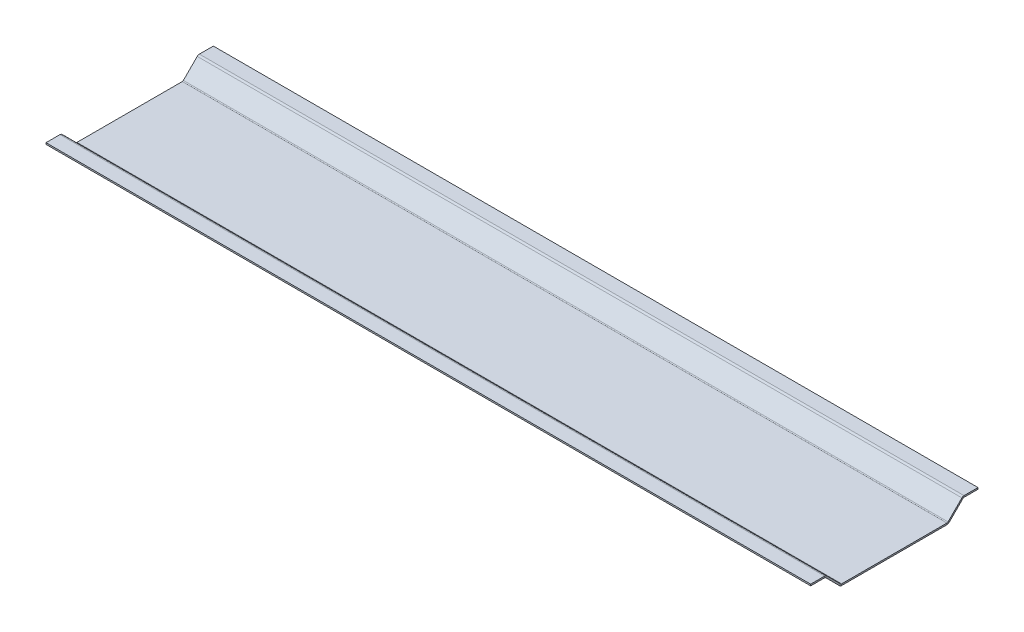
ISO-10303-21;
HEADER;
FILE_DESCRIPTION(('STEP AP214'),'2;1');
FILE_NAME('part.step','',(''),(''),'','','');
FILE_SCHEMA(('AUTOMOTIVE_DESIGN { 1 0 10303 214 1 1 1 1 }'));
ENDSEC;
DATA;
#1=APPLICATION_CONTEXT('core data for automotive mechanical design processes');
#2=APPLICATION_PROTOCOL_DEFINITION('international standard','automotive_design',2000,#1);
#3=PRODUCT_CONTEXT('',#1,'mechanical');
#4=PRODUCT('Part','Part','',(#3));
#5=PRODUCT_RELATED_PRODUCT_CATEGORY('part','',(#4));
#6=PRODUCT_DEFINITION_FORMATION('','',#4);
#7=PRODUCT_DEFINITION_CONTEXT('part definition',#1,'design');
#8=PRODUCT_DEFINITION('design','',#6,#7);
#9=PRODUCT_DEFINITION_SHAPE('','',#8);
#10=(LENGTH_UNIT() NAMED_UNIT(*) SI_UNIT(.MILLI.,.METRE.));
#11=(NAMED_UNIT(*) PLANE_ANGLE_UNIT() SI_UNIT($,.RADIAN.));
#12=(NAMED_UNIT(*) SI_UNIT($,.STERADIAN.) SOLID_ANGLE_UNIT());
#13=UNCERTAINTY_MEASURE_WITH_UNIT(LENGTH_MEASURE(1.E-05),#10,'distance_accuracy_value','');
#14=(GEOMETRIC_REPRESENTATION_CONTEXT(3) GLOBAL_UNCERTAINTY_ASSIGNED_CONTEXT((#13)) GLOBAL_UNIT_ASSIGNED_CONTEXT((#10,
#11,#12)) REPRESENTATION_CONTEXT('',''));
#15=CARTESIAN_POINT('',(0.,0.,0.));
#16=DIRECTION('',(0.,0.,1.));
#17=DIRECTION('',(1.,0.,0.));
#18=AXIS2_PLACEMENT_3D('',#15,#16,#17);
#19=CARTESIAN_POINT('',(-494.133821974281,0.,67.5));
#20=DIRECTION('',(0.,1.,0.));
#21=DIRECTION('',(0.,0.,1.));
#22=AXIS2_PLACEMENT_3D('',#19,#20,#21);
#23=PLANE('',#22);
#24=DIRECTION('',(1.,0.,0.));
#25=VECTOR('',#24,1.);
#26=CARTESIAN_POINT('',(-494.133821974281,0.,68.7426406871193));
#27=LINE('',#26,#25);
#28=CARTESIAN_POINT('',(-377.,0.,68.7426406871193));
#29=VERTEX_POINT('',#28);
#30=CARTESIAN_POINT('',(377.,0.,68.7426406871193));
#31=VERTEX_POINT('',#30);
#32=EDGE_CURVE('E11',#29,#31,#27,.T.);
#33=ORIENTED_EDGE('',*,*,#32,.F.);
#34=DIRECTION('',(0.,0.,-1.));
#35=VECTOR('',#34,1.);
#36=CARTESIAN_POINT('',(-377.,0.,67.5));
#37=LINE('',#36,#35);
#38=CARTESIAN_POINT('',(-377.,0.,82.5));
#39=VERTEX_POINT('',#38);
#40=EDGE_CURVE('E350',#39,#29,#37,.T.);
#41=ORIENTED_EDGE('',*,*,#40,.F.);
#42=DIRECTION('',(1.,0.,0.));
#43=VECTOR('',#42,1.);
#44=CARTESIAN_POINT('',(-494.133821974281,0.,82.5));
#45=LINE('',#44,#43);
#46=CARTESIAN_POINT('',(377.,0.,82.5));
#47=VERTEX_POINT('',#46);
#48=EDGE_CURVE('E44',#39,#47,#45,.T.);
#49=ORIENTED_EDGE('',*,*,#48,.T.);
#50=DIRECTION('',(0.,0.,-1.));
#51=VECTOR('',#50,1.);
#52=CARTESIAN_POINT('',(377.,0.,67.5));
#53=LINE('',#52,#51);
#54=EDGE_CURVE('E261',#47,#31,#53,.T.);
#55=ORIENTED_EDGE('',*,*,#54,.T.);
#56=EDGE_LOOP('',(#33,#41,#49,#55));
#57=FACE_BOUND('',#56,.T.);
#58=ADVANCED_FACE('F41',(#57),#23,.T.);
#59=CARTESIAN_POINT('',(-494.133821974281,-3.,68.7426406871193));
#60=DIRECTION('',(1.,0.,0.));
#61=DIRECTION('',(0.,0.,-1.));
#62=AXIS2_PLACEMENT_3D('',#59,#60,#61);
#63=CYLINDRICAL_SURFACE('',#62,3.);
#64=DIRECTION('',(1.,0.,0.));
#65=VECTOR('',#64,1.);
#66=CARTESIAN_POINT('',(-494.133821974281,-0.878679656440352,66.6213203435596));
#67=LINE('',#66,#65);
#68=CARTESIAN_POINT('',(-377.,-0.878679656440354,66.6213203435596));
#69=VERTEX_POINT('',#68);
#70=CARTESIAN_POINT('',(377.,-0.878679656440354,66.6213203435596));
#71=VERTEX_POINT('',#70);
#72=EDGE_CURVE('E49',#69,#71,#67,.T.);
#73=ORIENTED_EDGE('',*,*,#72,.F.);
#74=CARTESIAN_POINT('',(-377.,-3.,68.7426406871193));
#75=DIRECTION('',(-1.,0.,0.));
#76=DIRECTION('',(0.,-1.,0.));
#77=AXIS2_PLACEMENT_3D('',#74,#75,#76);
#78=CIRCLE('',#77,3.);
#79=EDGE_CURVE('E333',#29,#69,#78,.T.);
#80=ORIENTED_EDGE('',*,*,#79,.F.);
#81=ORIENTED_EDGE('',*,*,#32,.T.);
#82=CARTESIAN_POINT('',(377.,-3.,68.7426406871193));
#83=DIRECTION('',(-1.,0.,0.));
#84=DIRECTION('',(0.,-1.,0.));
#85=AXIS2_PLACEMENT_3D('',#82,#83,#84);
#86=CIRCLE('',#85,3.);
#87=EDGE_CURVE('E241',#31,#71,#86,.T.);
#88=ORIENTED_EDGE('',*,*,#87,.T.);
#89=EDGE_LOOP('',(#73,#80,#81,#88));
#90=FACE_BOUND('',#89,.T.);
#91=ADVANCED_FACE('F399',(#90),#63,.T.);
#92=CARTESIAN_POINT('',(-494.133821974281,-15.,52.5));
#93=DIRECTION('',(0.,0.707106781186546,-0.707106781186549));
#94=DIRECTION('',(0.,0.707106781186549,0.707106781186546));
#95=AXIS2_PLACEMENT_3D('',#92,#93,#94);
#96=PLANE('',#95);
#97=DIRECTION('',(1.,0.,0.));
#98=VECTOR('',#97,1.);
#99=CARTESIAN_POINT('',(-494.133821974281,-14.5606601717798,52.9393398282202));
#100=LINE('',#99,#98);
#101=CARTESIAN_POINT('',(-377.,-14.5606601717798,52.9393398282202));
#102=VERTEX_POINT('',#101);
#103=CARTESIAN_POINT('',(377.,-14.5606601717798,52.9393398282202));
#104=VERTEX_POINT('',#103);
#105=EDGE_CURVE('E366',#102,#104,#100,.T.);
#106=ORIENTED_EDGE('',*,*,#105,.F.);
#107=DIRECTION('',(0.,0.707106781186549,0.707106781186546));
#108=VECTOR('',#107,1.);
#109=CARTESIAN_POINT('',(-377.,-15.,52.5));
#110=LINE('',#109,#108);
#111=EDGE_CURVE('E340',#69,#102,#110,.F.);
#112=ORIENTED_EDGE('',*,*,#111,.F.);
#113=ORIENTED_EDGE('',*,*,#72,.T.);
#114=DIRECTION('',(0.,0.707106781186549,0.707106781186546));
#115=VECTOR('',#114,1.);
#116=CARTESIAN_POINT('',(377.,-15.,52.5));
#117=LINE('',#116,#115);
#118=EDGE_CURVE('E250',#71,#104,#117,.F.);
#119=ORIENTED_EDGE('',*,*,#118,.T.);
#120=EDGE_LOOP('',(#106,#112,#113,#119));
#121=FACE_BOUND('',#120,.T.);
#122=ADVANCED_FACE('F408',(#121),#96,.T.);
#123=CARTESIAN_POINT('',(-494.133821974281,-13.5,51.8786796564404));
#124=DIRECTION('',(1.,0.,0.));
#125=DIRECTION('',(0.,0.,-1.));
#126=AXIS2_PLACEMENT_3D('',#123,#124,#125);
#127=CYLINDRICAL_SURFACE('',#126,1.5);
#128=DIRECTION('',(1.,0.,0.));
#129=VECTOR('',#128,1.);
#130=CARTESIAN_POINT('',(-494.133821974281,-15.,51.8786796564404));
#131=LINE('',#130,#129);
#132=CARTESIAN_POINT('',(-377.,-15.,51.8786796564404));
#133=VERTEX_POINT('',#132);
#134=CARTESIAN_POINT('',(377.,-15.,51.8786796564404));
#135=VERTEX_POINT('',#134);
#136=EDGE_CURVE('E368',#133,#135,#131,.T.);
#137=ORIENTED_EDGE('',*,*,#136,.F.);
#138=CARTESIAN_POINT('',(-377.,-13.5,51.8786796564404));
#139=DIRECTION('',(-1.,0.,0.));
#140=DIRECTION('',(0.,-1.,0.));
#141=AXIS2_PLACEMENT_3D('',#138,#139,#140);
#142=CIRCLE('',#141,1.5);
#143=EDGE_CURVE('E334',#102,#133,#142,.F.);
#144=ORIENTED_EDGE('',*,*,#143,.F.);
#145=ORIENTED_EDGE('',*,*,#105,.T.);
#146=CARTESIAN_POINT('',(377.,-13.5,51.8786796564404));
#147=DIRECTION('',(-1.,0.,0.));
#148=DIRECTION('',(0.,-1.,0.));
#149=AXIS2_PLACEMENT_3D('',#146,#147,#148);
#150=CIRCLE('',#149,1.5);
#151=EDGE_CURVE('E242',#104,#135,#150,.F.);
#152=ORIENTED_EDGE('',*,*,#151,.T.);
#153=EDGE_LOOP('',(#137,#144,#145,#152));
#154=FACE_BOUND('',#153,.T.);
#155=ADVANCED_FACE('F412',(#154),#127,.F.);
#156=CARTESIAN_POINT('',(-494.133821974281,-15.,0.));
#157=DIRECTION('',(0.,1.,0.));
#158=DIRECTION('',(0.,0.,1.));
#159=AXIS2_PLACEMENT_3D('',#156,#157,#158);
#160=PLANE('',#159);
#161=ORIENTED_EDGE('',*,*,#136,.T.);
#162=DIRECTION('',(0.,0.,1.));
#163=VECTOR('',#162,1.);
#164=CARTESIAN_POINT('',(377.,-15.,0.));
#165=LINE('',#164,#163);
#166=CARTESIAN_POINT('',(377.,-14.9999999999999,-51.8786796564404));
#167=VERTEX_POINT('',#166);
#168=EDGE_CURVE('E264',#135,#167,#165,.F.);
#169=ORIENTED_EDGE('',*,*,#168,.T.);
#170=DIRECTION('',(1.,0.,0.));
#171=VECTOR('',#170,1.);
#172=CARTESIAN_POINT('',(-494.133821974281,-14.9999999999999,-51.8786796564404));
#173=LINE('',#172,#171);
#174=CARTESIAN_POINT('',(-377.,-14.9999999999999,-51.8786796564404));
#175=VERTEX_POINT('',#174);
#176=EDGE_CURVE('E323',#175,#167,#173,.T.);
#177=ORIENTED_EDGE('',*,*,#176,.F.);
#178=DIRECTION('',(0.,0.,1.));
#179=VECTOR('',#178,1.);
#180=CARTESIAN_POINT('',(-377.,-15.,0.));
#181=LINE('',#180,#179);
#182=EDGE_CURVE('E353',#133,#175,#181,.F.);
#183=ORIENTED_EDGE('',*,*,#182,.F.);
#184=EDGE_LOOP('',(#161,#169,#177,#183));
#185=FACE_BOUND('',#184,.T.);
#186=ADVANCED_FACE('F429',(#185),#160,.T.);
#187=CARTESIAN_POINT('',(-494.133821974281,-16.5,0.));
#188=DIRECTION('',(0.,1.,0.));
#189=DIRECTION('',(0.,0.,1.));
#190=AXIS2_PLACEMENT_3D('',#187,#188,#189);
#191=PLANE('',#190);
#192=DIRECTION('',(0.,0.,-1.));
#193=VECTOR('',#192,1.);
#194=CARTESIAN_POINT('',(-377.,-16.5,0.));
#195=LINE('',#194,#193);
#196=CARTESIAN_POINT('',(-377.,-16.5,51.8786796564404));
#197=VERTEX_POINT('',#196);
#198=CARTESIAN_POINT('',(-377.,-16.5,-51.8786796564404));
#199=VERTEX_POINT('',#198);
#200=EDGE_CURVE('E336',#197,#199,#195,.T.);
#201=ORIENTED_EDGE('',*,*,#200,.T.);
#202=DIRECTION('',(1.,0.,0.));
#203=VECTOR('',#202,1.);
#204=CARTESIAN_POINT('',(-494.133821974281,-16.5,-51.8786796564404));
#205=LINE('',#204,#203);
#206=CARTESIAN_POINT('',(377.,-16.5,-51.8786796564404));
#207=VERTEX_POINT('',#206);
#208=EDGE_CURVE('E325',#199,#207,#205,.T.);
#209=ORIENTED_EDGE('',*,*,#208,.T.);
#210=DIRECTION('',(0.,0.,-1.));
#211=VECTOR('',#210,1.);
#212=CARTESIAN_POINT('',(377.,-16.5,0.));
#213=LINE('',#212,#211);
#214=CARTESIAN_POINT('',(377.,-16.5,51.8786796564404));
#215=VERTEX_POINT('',#214);
#216=EDGE_CURVE('E245',#215,#207,#213,.T.);
#217=ORIENTED_EDGE('',*,*,#216,.F.);
#218=DIRECTION('',(1.,0.,0.));
#219=VECTOR('',#218,1.);
#220=CARTESIAN_POINT('',(-494.133821974281,-16.5,51.8786796564404));
#221=LINE('',#220,#219);
#222=EDGE_CURVE('E370',#197,#215,#221,.T.);
#223=ORIENTED_EDGE('',*,*,#222,.F.);
#224=EDGE_LOOP('',(#201,#209,#217,#223));
#225=FACE_BOUND('',#224,.T.);
#226=ADVANCED_FACE('F458',(#225),#191,.F.);
#227=CARTESIAN_POINT('',(-494.133821974281,-13.5,51.8786796564404));
#228=DIRECTION('',(1.,0.,0.));
#229=DIRECTION('',(0.,0.,-1.));
#230=AXIS2_PLACEMENT_3D('',#227,#228,#229);
#231=CYLINDRICAL_SURFACE('',#230,3.);
#232=CARTESIAN_POINT('',(-377.,-13.5,51.8786796564404));
#233=DIRECTION('',(1.,0.,0.));
#234=DIRECTION('',(0.,1.,0.));
#235=AXIS2_PLACEMENT_3D('',#232,#233,#234);
#236=CIRCLE('',#235,3.);
#237=CARTESIAN_POINT('',(-377.,-15.6213203435597,54.));
#238=VERTEX_POINT('',#237);
#239=EDGE_CURVE('E318',#238,#197,#236,.T.);
#240=ORIENTED_EDGE('',*,*,#239,.T.);
#241=ORIENTED_EDGE('',*,*,#222,.T.);
#242=CARTESIAN_POINT('',(377.,-13.5,51.8786796564404));
#243=DIRECTION('',(1.,0.,0.));
#244=DIRECTION('',(0.,1.,0.));
#245=AXIS2_PLACEMENT_3D('',#242,#243,#244);
#246=CIRCLE('',#245,3.);
#247=CARTESIAN_POINT('',(377.,-15.6213203435597,54.));
#248=VERTEX_POINT('',#247);
#249=EDGE_CURVE('E235',#248,#215,#246,.T.);
#250=ORIENTED_EDGE('',*,*,#249,.F.);
#251=DIRECTION('',(1.,0.,0.));
#252=VECTOR('',#251,1.);
#253=CARTESIAN_POINT('',(-494.133821974281,-15.6213203435597,54.));
#254=LINE('',#253,#252);
#255=EDGE_CURVE('E372',#238,#248,#254,.T.);
#256=ORIENTED_EDGE('',*,*,#255,.F.);
#257=EDGE_LOOP('',(#240,#241,#250,#256));
#258=FACE_BOUND('',#257,.T.);
#259=ADVANCED_FACE('F463',(#258),#231,.T.);
#260=CARTESIAN_POINT('',(-494.133821974281,-16.0606601717798,53.5606601717798));
#261=DIRECTION('',(0.,0.707106781186547,-0.707106781186549));
#262=DIRECTION('',(0.,0.707106781186549,0.707106781186546));
#263=AXIS2_PLACEMENT_3D('',#260,#261,#262);
#264=PLANE('',#263);
#265=DIRECTION('',(0.,-0.707106781186549,-0.707106781186546));
#266=VECTOR('',#265,1.);
#267=CARTESIAN_POINT('',(-377.,-16.06066017178,53.5606601717797));
#268=LINE('',#267,#266);
#269=CARTESIAN_POINT('',(-377.,-1.93933982822017,67.6819805153395));
#270=VERTEX_POINT('',#269);
#271=EDGE_CURVE('E343',#270,#238,#268,.T.);
#272=ORIENTED_EDGE('',*,*,#271,.T.);
#273=ORIENTED_EDGE('',*,*,#255,.T.);
#274=DIRECTION('',(0.,-0.707106781186549,-0.707106781186546));
#275=VECTOR('',#274,1.);
#276=CARTESIAN_POINT('',(377.,-16.06066017178,53.5606601717797));
#277=LINE('',#276,#275);
#278=CARTESIAN_POINT('',(377.,-1.93933982822017,67.6819805153395));
#279=VERTEX_POINT('',#278);
#280=EDGE_CURVE('E254',#279,#248,#277,.T.);
#281=ORIENTED_EDGE('',*,*,#280,.F.);
#282=DIRECTION('',(1.,0.,0.));
#283=VECTOR('',#282,1.);
#284=CARTESIAN_POINT('',(-494.133821974281,-1.93933982822018,67.6819805153395));
#285=LINE('',#284,#283);
#286=EDGE_CURVE('E374',#270,#279,#285,.T.);
#287=ORIENTED_EDGE('',*,*,#286,.F.);
#288=EDGE_LOOP('',(#272,#273,#281,#287));
#289=FACE_BOUND('',#288,.T.);
#290=ADVANCED_FACE('F468',(#289),#264,.F.);
#291=CARTESIAN_POINT('',(-494.133821974281,-3.,68.7426406871193));
#292=DIRECTION('',(1.,0.,0.));
#293=DIRECTION('',(0.,0.,-1.));
#294=AXIS2_PLACEMENT_3D('',#291,#292,#293);
#295=CYLINDRICAL_SURFACE('',#294,1.5);
#296=CARTESIAN_POINT('',(-377.,-3.,68.7426406871193));
#297=DIRECTION('',(1.,0.,0.));
#298=DIRECTION('',(0.,1.,0.));
#299=AXIS2_PLACEMENT_3D('',#296,#297,#298);
#300=CIRCLE('',#299,1.5);
#301=CARTESIAN_POINT('',(-377.,-1.5,68.7426406871193));
#302=VERTEX_POINT('',#301);
#303=EDGE_CURVE('E66',#302,#270,#300,.F.);
#304=ORIENTED_EDGE('',*,*,#303,.T.);
#305=ORIENTED_EDGE('',*,*,#286,.T.);
#306=CARTESIAN_POINT('',(377.,-3.,68.7426406871193));
#307=DIRECTION('',(1.,0.,0.));
#308=DIRECTION('',(0.,1.,0.));
#309=AXIS2_PLACEMENT_3D('',#306,#307,#308);
#310=CIRCLE('',#309,1.5);
#311=CARTESIAN_POINT('',(377.,-1.5,68.7426406871193));
#312=VERTEX_POINT('',#311);
#313=EDGE_CURVE('E238',#312,#279,#310,.F.);
#314=ORIENTED_EDGE('',*,*,#313,.F.);
#315=DIRECTION('',(1.,0.,0.));
#316=VECTOR('',#315,1.);
#317=CARTESIAN_POINT('',(-494.133821974281,-1.5,68.7426406871193));
#318=LINE('',#317,#316);
#319=EDGE_CURVE('E376',#302,#312,#318,.T.);
#320=ORIENTED_EDGE('',*,*,#319,.F.);
#321=EDGE_LOOP('',(#304,#305,#314,#320));
#322=FACE_BOUND('',#321,.T.);
#323=ADVANCED_FACE('F470',(#322),#295,.F.);
#324=CARTESIAN_POINT('',(-494.133821974281,-1.5,67.5));
#325=DIRECTION('',(0.,1.,0.));
#326=DIRECTION('',(0.,0.,1.));
#327=AXIS2_PLACEMENT_3D('',#324,#325,#326);
#328=PLANE('',#327);
#329=DIRECTION('',(0.,0.,1.));
#330=VECTOR('',#329,1.);
#331=CARTESIAN_POINT('',(-377.,-1.5,67.5));
#332=LINE('',#331,#330);
#333=CARTESIAN_POINT('',(-377.,-1.5,82.5));
#334=VERTEX_POINT('',#333);
#335=EDGE_CURVE('E57',#334,#302,#332,.F.);
#336=ORIENTED_EDGE('',*,*,#335,.T.);
#337=ORIENTED_EDGE('',*,*,#319,.T.);
#338=DIRECTION('',(0.,0.,1.));
#339=VECTOR('',#338,1.);
#340=CARTESIAN_POINT('',(377.,-1.5,67.5));
#341=LINE('',#340,#339);
#342=CARTESIAN_POINT('',(377.,-1.5,82.5));
#343=VERTEX_POINT('',#342);
#344=EDGE_CURVE('E271',#343,#312,#341,.F.);
#345=ORIENTED_EDGE('',*,*,#344,.F.);
#346=DIRECTION('',(1.,0.,0.));
#347=VECTOR('',#346,1.);
#348=CARTESIAN_POINT('',(-494.133821974281,-1.5,82.5));
#349=LINE('',#348,#347);
#350=EDGE_CURVE('E377',#334,#343,#349,.T.);
#351=ORIENTED_EDGE('',*,*,#350,.F.);
#352=EDGE_LOOP('',(#336,#337,#345,#351));
#353=FACE_BOUND('',#352,.T.);
#354=ADVANCED_FACE('F473',(#353),#328,.F.);
#355=CARTESIAN_POINT('',(-494.133821974281,-1.5,82.5));
#356=DIRECTION('',(0.,0.,-1.));
#357=DIRECTION('',(-1.,0.,0.));
#358=AXIS2_PLACEMENT_3D('',#355,#356,#357);
#359=PLANE('',#358);
#360=DIRECTION('',(0.,1.,0.));
#361=VECTOR('',#360,1.);
#362=CARTESIAN_POINT('',(-377.,0.,82.5));
#363=LINE('',#362,#361);
#364=EDGE_CURVE('E359',#39,#334,#363,.F.);
#365=ORIENTED_EDGE('',*,*,#364,.T.);
#366=ORIENTED_EDGE('',*,*,#350,.T.);
#367=DIRECTION('',(0.,1.,0.));
#368=VECTOR('',#367,1.);
#369=CARTESIAN_POINT('',(377.,0.,82.5));
#370=LINE('',#369,#368);
#371=EDGE_CURVE('E274',#47,#343,#370,.F.);
#372=ORIENTED_EDGE('',*,*,#371,.F.);
#373=ORIENTED_EDGE('',*,*,#48,.F.);
#374=EDGE_LOOP('',(#365,#366,#372,#373));
#375=FACE_BOUND('',#374,.T.);
#376=ADVANCED_FACE('F386',(#375),#359,.F.);
#377=CARTESIAN_POINT('',(-377.,0.,67.5));
#378=DIRECTION('',(1.,0.,0.));
#379=DIRECTION('',(0.,0.,-1.));
#380=AXIS2_PLACEMENT_3D('',#377,#378,#379);
#381=PLANE('',#380);
#382=ORIENTED_EDGE('',*,*,#40,.T.);
#383=DIRECTION('',(0.,1.,0.));
#384=VECTOR('',#383,1.);
#385=CARTESIAN_POINT('',(-377.,0.,68.7426406871193));
#386=LINE('',#385,#384);
#387=EDGE_CURVE('E362',#29,#302,#386,.F.);
#388=ORIENTED_EDGE('',*,*,#387,.T.);
#389=ORIENTED_EDGE('',*,*,#335,.F.);
#390=ORIENTED_EDGE('',*,*,#364,.F.);
#391=EDGE_LOOP('',(#382,#388,#389,#390));
#392=FACE_BOUND('',#391,.T.);
#393=ADVANCED_FACE('F480',(#392),#381,.F.);
#394=CARTESIAN_POINT('',(-377.,-16.5,0.));
#395=DIRECTION('',(1.,0.,0.));
#396=DIRECTION('',(0.,0.,-1.));
#397=AXIS2_PLACEMENT_3D('',#394,#395,#396);
#398=PLANE('',#397);
#399=ORIENTED_EDGE('',*,*,#182,.T.);
#400=DIRECTION('',(0.,-1.,0.));
#401=VECTOR('',#400,1.);
#402=CARTESIAN_POINT('',(-377.,-16.5,-51.8786796564404));
#403=LINE('',#402,#401);
#404=EDGE_CURVE('E290',#199,#175,#403,.F.);
#405=ORIENTED_EDGE('',*,*,#404,.F.);
#406=ORIENTED_EDGE('',*,*,#200,.F.);
#407=DIRECTION('',(0.,-1.,0.));
#408=VECTOR('',#407,1.);
#409=CARTESIAN_POINT('',(-377.,-16.5,51.8786796564404));
#410=LINE('',#409,#408);
#411=EDGE_CURVE('E346',#197,#133,#410,.F.);
#412=ORIENTED_EDGE('',*,*,#411,.T.);
#413=EDGE_LOOP('',(#399,#405,#406,#412));
#414=FACE_BOUND('',#413,.T.);
#415=ADVANCED_FACE('F433',(#414),#398,.F.);
#416=CARTESIAN_POINT('',(-377.,-13.5,51.8786796564404));
#417=DIRECTION('',(-1.,0.,0.));
#418=DIRECTION('',(0.,-1.,0.));
#419=AXIS2_PLACEMENT_3D('',#416,#417,#418);
#420=PLANE('',#419);
#421=ORIENTED_EDGE('',*,*,#143,.T.);
#422=ORIENTED_EDGE('',*,*,#411,.F.);
#423=ORIENTED_EDGE('',*,*,#239,.F.);
#424=DIRECTION('',(0.,-0.707106781186547,0.707106781186549));
#425=VECTOR('',#424,1.);
#426=CARTESIAN_POINT('',(-377.,-15.6213203435597,54.));
#427=LINE('',#426,#425);
#428=EDGE_CURVE('E347',#238,#102,#427,.F.);
#429=ORIENTED_EDGE('',*,*,#428,.T.);
#430=EDGE_LOOP('',(#421,#422,#423,#429));
#431=FACE_BOUND('',#430,.T.);
#432=ADVANCED_FACE('F465',(#431),#420,.T.);
#433=CARTESIAN_POINT('',(-377.,-16.06066017178,53.5606601717797));
#434=DIRECTION('',(1.,0.,0.));
#435=DIRECTION('',(0.,-0.707106781186549,-0.707106781186546));
#436=AXIS2_PLACEMENT_3D('',#433,#434,#435);
#437=PLANE('',#436);
#438=ORIENTED_EDGE('',*,*,#428,.F.);
#439=ORIENTED_EDGE('',*,*,#271,.F.);
#440=DIRECTION('',(0.,-0.707106781186547,0.707106781186549));
#441=VECTOR('',#440,1.);
#442=CARTESIAN_POINT('',(-377.,-1.93933982822017,67.6819805153395));
#443=LINE('',#442,#441);
#444=EDGE_CURVE('E342',#270,#69,#443,.F.);
#445=ORIENTED_EDGE('',*,*,#444,.T.);
#446=ORIENTED_EDGE('',*,*,#111,.T.);
#447=EDGE_LOOP('',(#438,#439,#445,#446));
#448=FACE_BOUND('',#447,.T.);
#449=ADVANCED_FACE('F405',(#448),#437,.F.);
#450=CARTESIAN_POINT('',(-377.,-3.,68.7426406871193));
#451=DIRECTION('',(-1.,0.,0.));
#452=DIRECTION('',(0.,-1.,0.));
#453=AXIS2_PLACEMENT_3D('',#450,#451,#452);
#454=PLANE('',#453);
#455=ORIENTED_EDGE('',*,*,#79,.T.);
#456=ORIENTED_EDGE('',*,*,#444,.F.);
#457=ORIENTED_EDGE('',*,*,#303,.F.);
#458=ORIENTED_EDGE('',*,*,#387,.F.);
#459=EDGE_LOOP('',(#455,#456,#457,#458));
#460=FACE_BOUND('',#459,.T.);
#461=ADVANCED_FACE('F401',(#460),#454,.T.);
#462=CARTESIAN_POINT('',(-494.133821974281,0.,-67.5));
#463=DIRECTION('',(0.,1.,0.));
#464=DIRECTION('',(0.,0.,-1.));
#465=AXIS2_PLACEMENT_3D('',#462,#463,#464);
#466=PLANE('',#465);
#467=DIRECTION('',(1.,0.,0.));
#468=VECTOR('',#467,1.);
#469=CARTESIAN_POINT('',(-494.133821974281,0.,-68.7426406871193));
#470=LINE('',#469,#468);
#471=CARTESIAN_POINT('',(-377.,0.,-68.7426406871193));
#472=VERTEX_POINT('',#471);
#473=CARTESIAN_POINT('',(377.,0.,-68.7426406871193));
#474=VERTEX_POINT('',#473);
#475=EDGE_CURVE('E316',#472,#474,#470,.T.);
#476=ORIENTED_EDGE('',*,*,#475,.T.);
#477=DIRECTION('',(0.,0.,1.));
#478=VECTOR('',#477,1.);
#479=CARTESIAN_POINT('',(377.,0.,-67.5));
#480=LINE('',#479,#478);
#481=CARTESIAN_POINT('',(377.,1.08121276247753E-13,-82.5));
#482=VERTEX_POINT('',#481);
#483=EDGE_CURVE('E225',#482,#474,#480,.T.);
#484=ORIENTED_EDGE('',*,*,#483,.F.);
#485=DIRECTION('',(1.,0.,0.));
#486=VECTOR('',#485,1.);
#487=CARTESIAN_POINT('',(-494.133821974281,1.08121276247753E-13,-82.5));
#488=LINE('',#487,#486);
#489=CARTESIAN_POINT('',(-377.,1.08121276247753E-13,-82.5));
#490=VERTEX_POINT('',#489);
#491=EDGE_CURVE('E314',#490,#482,#488,.T.);
#492=ORIENTED_EDGE('',*,*,#491,.F.);
#493=DIRECTION('',(0.,0.,1.));
#494=VECTOR('',#493,1.);
#495=CARTESIAN_POINT('',(-377.,0.,-67.5));
#496=LINE('',#495,#494);
#497=EDGE_CURVE('E302',#490,#472,#496,.T.);
#498=ORIENTED_EDGE('',*,*,#497,.T.);
#499=EDGE_LOOP('',(#476,#484,#492,#498));
#500=FACE_BOUND('',#499,.T.);
#501=ADVANCED_FACE('F532',(#500),#466,.T.);
#502=CARTESIAN_POINT('',(-494.133821974281,-2.99999999999991,-68.7426406871193));
#503=DIRECTION('',(1.,0.,0.));
#504=DIRECTION('',(0.,0.,1.));
#505=AXIS2_PLACEMENT_3D('',#502,#503,#504);
#506=CYLINDRICAL_SURFACE('',#505,3.);
#507=DIRECTION('',(1.,0.,0.));
#508=VECTOR('',#507,1.);
#509=CARTESIAN_POINT('',(-494.133821974281,-0.878679656440264,-66.6213203435596));
#510=LINE('',#509,#508);
#511=CARTESIAN_POINT('',(-377.,-0.878679656440266,-66.6213203435596));
#512=VERTEX_POINT('',#511);
#513=CARTESIAN_POINT('',(377.,-0.878679656440266,-66.6213203435596));
#514=VERTEX_POINT('',#513);
#515=EDGE_CURVE('E319',#512,#514,#510,.T.);
#516=ORIENTED_EDGE('',*,*,#515,.T.);
#517=CARTESIAN_POINT('',(377.,-2.99999999999991,-68.7426406871193));
#518=DIRECTION('',(1.,0.,0.));
#519=DIRECTION('',(0.,-1.,0.));
#520=AXIS2_PLACEMENT_3D('',#517,#518,#519);
#521=CIRCLE('',#520,3.);
#522=EDGE_CURVE('E203',#474,#514,#521,.T.);
#523=ORIENTED_EDGE('',*,*,#522,.F.);
#524=ORIENTED_EDGE('',*,*,#475,.F.);
#525=CARTESIAN_POINT('',(-377.,-2.99999999999991,-68.7426406871193));
#526=DIRECTION('',(1.,0.,0.));
#527=DIRECTION('',(0.,-1.,0.));
#528=AXIS2_PLACEMENT_3D('',#525,#526,#527);
#529=CIRCLE('',#528,3.);
#530=EDGE_CURVE('E286',#472,#512,#529,.T.);
#531=ORIENTED_EDGE('',*,*,#530,.T.);
#532=EDGE_LOOP('',(#516,#523,#524,#531));
#533=FACE_BOUND('',#532,.T.);
#534=ADVANCED_FACE('F536',(#533),#506,.T.);
#535=CARTESIAN_POINT('',(-494.133821974281,-14.9999999999999,-52.5));
#536=DIRECTION('',(0.,0.707106781186546,0.70710678118655));
#537=DIRECTION('',(0.,0.70710678118655,-0.707106781186546));
#538=AXIS2_PLACEMENT_3D('',#535,#536,#537);
#539=PLANE('',#538);
#540=DIRECTION('',(1.,0.,0.));
#541=VECTOR('',#540,1.);
#542=CARTESIAN_POINT('',(-494.133821974281,-14.5606601717798,-52.9393398282202));
#543=LINE('',#542,#541);
#544=CARTESIAN_POINT('',(-377.,-14.5606601717798,-52.9393398282202));
#545=VERTEX_POINT('',#544);
#546=CARTESIAN_POINT('',(377.,-14.5606601717798,-52.9393398282202));
#547=VERTEX_POINT('',#546);
#548=EDGE_CURVE('E321',#545,#547,#543,.T.);
#549=ORIENTED_EDGE('',*,*,#548,.T.);
#550=DIRECTION('',(0.,0.707106781186549,-0.707106781186546));
#551=VECTOR('',#550,1.);
#552=CARTESIAN_POINT('',(377.,-14.9999999999999,-52.5));
#553=LINE('',#552,#551);
#554=EDGE_CURVE('E208',#514,#547,#553,.F.);
#555=ORIENTED_EDGE('',*,*,#554,.F.);
#556=ORIENTED_EDGE('',*,*,#515,.F.);
#557=DIRECTION('',(0.,0.707106781186549,-0.707106781186546));
#558=VECTOR('',#557,1.);
#559=CARTESIAN_POINT('',(-377.,-14.9999999999999,-52.5));
#560=LINE('',#559,#558);
#561=EDGE_CURVE('E295',#512,#545,#560,.F.);
#562=ORIENTED_EDGE('',*,*,#561,.T.);
#563=EDGE_LOOP('',(#549,#555,#556,#562));
#564=FACE_BOUND('',#563,.T.);
#565=ADVANCED_FACE('F446',(#564),#539,.T.);
#566=CARTESIAN_POINT('',(-494.133821974281,-13.4999999999999,-51.8786796564404));
#567=DIRECTION('',(1.,0.,0.));
#568=DIRECTION('',(0.,0.,1.));
#569=AXIS2_PLACEMENT_3D('',#566,#567,#568);
#570=CYLINDRICAL_SURFACE('',#569,1.5);
#571=ORIENTED_EDGE('',*,*,#176,.T.);
#572=CARTESIAN_POINT('',(377.,-13.4999999999999,-51.8786796564404));
#573=DIRECTION('',(1.,0.,0.));
#574=DIRECTION('',(0.,-1.,0.));
#575=AXIS2_PLACEMENT_3D('',#572,#573,#574);
#576=CIRCLE('',#575,1.5);
#577=EDGE_CURVE('E213',#547,#167,#576,.F.);
#578=ORIENTED_EDGE('',*,*,#577,.F.);
#579=ORIENTED_EDGE('',*,*,#548,.F.);
#580=CARTESIAN_POINT('',(-377.,-13.4999999999999,-51.8786796564404));
#581=DIRECTION('',(1.,0.,0.));
#582=DIRECTION('',(0.,-1.,0.));
#583=AXIS2_PLACEMENT_3D('',#580,#581,#582);
#584=CIRCLE('',#583,1.5);
#585=EDGE_CURVE('E287',#545,#175,#584,.F.);
#586=ORIENTED_EDGE('',*,*,#585,.T.);
#587=EDGE_LOOP('',(#571,#578,#579,#586));
#588=FACE_BOUND('',#587,.T.);
#589=ADVANCED_FACE('F442',(#588),#570,.F.);
#590=CARTESIAN_POINT('',(-494.133821974281,-13.4999999999999,-51.8786796564404));
#591=DIRECTION('',(1.,0.,0.));
#592=DIRECTION('',(0.,0.,1.));
#593=AXIS2_PLACEMENT_3D('',#590,#591,#592);
#594=CYLINDRICAL_SURFACE('',#593,3.);
#595=CARTESIAN_POINT('',(-377.,-13.4999999999999,-51.8786796564404));
#596=DIRECTION('',(-1.,0.,0.));
#597=DIRECTION('',(0.,1.,0.));
#598=AXIS2_PLACEMENT_3D('',#595,#596,#597);
#599=CIRCLE('',#598,3.);
#600=CARTESIAN_POINT('',(-377.,-15.6213203435596,-54.));
#601=VERTEX_POINT('',#600);
#602=EDGE_CURVE('E280',#601,#199,#599,.T.);
#603=ORIENTED_EDGE('',*,*,#602,.F.);
#604=DIRECTION('',(1.,0.,0.));
#605=VECTOR('',#604,1.);
#606=CARTESIAN_POINT('',(-494.133821974281,-15.6213203435596,-54.));
#607=LINE('',#606,#605);
#608=CARTESIAN_POINT('',(377.,-15.6213203435596,-54.));
#609=VERTEX_POINT('',#608);
#610=EDGE_CURVE('E191',#601,#609,#607,.T.);
#611=ORIENTED_EDGE('',*,*,#610,.T.);
#612=CARTESIAN_POINT('',(377.,-13.4999999999999,-51.8786796564404));
#613=DIRECTION('',(-1.,0.,0.));
#614=DIRECTION('',(0.,1.,0.));
#615=AXIS2_PLACEMENT_3D('',#612,#613,#614);
#616=CIRCLE('',#615,3.);
#617=EDGE_CURVE('E452',#609,#207,#616,.T.);
#618=ORIENTED_EDGE('',*,*,#617,.T.);
#619=ORIENTED_EDGE('',*,*,#208,.F.);
#620=EDGE_LOOP('',(#603,#611,#618,#619));
#621=FACE_BOUND('',#620,.T.);
#622=ADVANCED_FACE('F456',(#621),#594,.T.);
#623=CARTESIAN_POINT('',(-494.133821974281,-16.0606601717798,-53.5606601717799));
#624=DIRECTION('',(0.,0.707106781186546,0.70710678118655));
#625=DIRECTION('',(0.,0.707106781186549,-0.707106781186546));
#626=AXIS2_PLACEMENT_3D('',#623,#624,#625);
#627=PLANE('',#626);
#628=DIRECTION('',(0.,-0.707106781186549,0.707106781186546));
#629=VECTOR('',#628,1.);
#630=CARTESIAN_POINT('',(-377.,-16.0606601717799,-53.5606601717797));
#631=LINE('',#630,#629);
#632=CARTESIAN_POINT('',(-377.,-1.93933982822008,-67.6819805153395));
#633=VERTEX_POINT('',#632);
#634=EDGE_CURVE('E187',#633,#601,#631,.T.);
#635=ORIENTED_EDGE('',*,*,#634,.F.);
#636=DIRECTION('',(1.,0.,0.));
#637=VECTOR('',#636,1.);
#638=CARTESIAN_POINT('',(-494.133821974281,-1.93933982822009,-67.6819805153395));
#639=LINE('',#638,#637);
#640=CARTESIAN_POINT('',(377.,-1.93933982822008,-67.6819805153395));
#641=VERTEX_POINT('',#640);
#642=EDGE_CURVE('E179',#633,#641,#639,.T.);
#643=ORIENTED_EDGE('',*,*,#642,.T.);
#644=DIRECTION('',(0.,-0.707106781186549,0.707106781186546));
#645=VECTOR('',#644,1.);
#646=CARTESIAN_POINT('',(377.,-16.0606601717799,-53.5606601717797));
#647=LINE('',#646,#645);
#648=EDGE_CURVE('E184',#641,#609,#647,.T.);
#649=ORIENTED_EDGE('',*,*,#648,.T.);
#650=ORIENTED_EDGE('',*,*,#610,.F.);
#651=EDGE_LOOP('',(#635,#643,#649,#650));
#652=FACE_BOUND('',#651,.T.);
#653=ADVANCED_FACE('F181',(#652),#627,.F.);
#654=CARTESIAN_POINT('',(-494.133821974281,-2.99999999999991,-68.7426406871193));
#655=DIRECTION('',(1.,0.,0.));
#656=DIRECTION('',(0.,0.,1.));
#657=AXIS2_PLACEMENT_3D('',#654,#655,#656);
#658=CYLINDRICAL_SURFACE('',#657,1.5);
#659=CARTESIAN_POINT('',(-377.,-2.99999999999991,-68.7426406871193));
#660=DIRECTION('',(-1.,0.,0.));
#661=DIRECTION('',(0.,1.,0.));
#662=AXIS2_PLACEMENT_3D('',#659,#660,#661);
#663=CIRCLE('',#662,1.5);
#664=CARTESIAN_POINT('',(-377.,-1.49999999999991,-68.7426406871193));
#665=VERTEX_POINT('',#664);
#666=EDGE_CURVE('E283',#665,#633,#663,.F.);
#667=ORIENTED_EDGE('',*,*,#666,.F.);
#668=DIRECTION('',(1.,0.,0.));
#669=VECTOR('',#668,1.);
#670=CARTESIAN_POINT('',(-494.133821974281,-1.49999999999991,-68.7426406871193));
#671=LINE('',#670,#669);
#672=CARTESIAN_POINT('',(377.,-1.49999999999991,-68.7426406871193));
#673=VERTEX_POINT('',#672);
#674=EDGE_CURVE('E192',#665,#673,#671,.T.);
#675=ORIENTED_EDGE('',*,*,#674,.T.);
#676=CARTESIAN_POINT('',(377.,-2.99999999999991,-68.7426406871193));
#677=DIRECTION('',(-1.,0.,0.));
#678=DIRECTION('',(0.,1.,0.));
#679=AXIS2_PLACEMENT_3D('',#676,#677,#678);
#680=CIRCLE('',#679,1.5);
#681=EDGE_CURVE('E201',#673,#641,#680,.F.);
#682=ORIENTED_EDGE('',*,*,#681,.T.);
#683=ORIENTED_EDGE('',*,*,#642,.F.);
#684=EDGE_LOOP('',(#667,#675,#682,#683));
#685=FACE_BOUND('',#684,.T.);
#686=ADVANCED_FACE('F210',(#685),#658,.F.);
#687=CARTESIAN_POINT('',(-494.133821974281,-1.49999999999991,-67.5));
#688=DIRECTION('',(0.,1.,0.));
#689=DIRECTION('',(0.,0.,-1.));
#690=AXIS2_PLACEMENT_3D('',#687,#688,#689);
#691=PLANE('',#690);
#692=DIRECTION('',(0.,0.,-1.));
#693=VECTOR('',#692,1.);
#694=CARTESIAN_POINT('',(-377.,-1.49999999999991,-67.5));
#695=LINE('',#694,#693);
#696=CARTESIAN_POINT('',(-377.,-1.49999999999989,-82.5));
#697=VERTEX_POINT('',#696);
#698=EDGE_CURVE('E306',#697,#665,#695,.F.);
#699=ORIENTED_EDGE('',*,*,#698,.F.);
#700=DIRECTION('',(1.,0.,0.));
#701=VECTOR('',#700,1.);
#702=CARTESIAN_POINT('',(-494.133821974281,-1.49999999999989,-82.5));
#703=LINE('',#702,#701);
#704=CARTESIAN_POINT('',(377.,-1.49999999999989,-82.5));
#705=VERTEX_POINT('',#704);
#706=EDGE_CURVE('E329',#697,#705,#703,.T.);
#707=ORIENTED_EDGE('',*,*,#706,.T.);
#708=DIRECTION('',(0.,0.,-1.));
#709=VECTOR('',#708,1.);
#710=CARTESIAN_POINT('',(377.,-1.49999999999991,-67.5));
#711=LINE('',#710,#709);
#712=EDGE_CURVE('E227',#705,#673,#711,.F.);
#713=ORIENTED_EDGE('',*,*,#712,.T.);
#714=ORIENTED_EDGE('',*,*,#674,.F.);
#715=EDGE_LOOP('',(#699,#707,#713,#714));
#716=FACE_BOUND('',#715,.T.);
#717=ADVANCED_FACE('F594',(#716),#691,.F.);
#718=CARTESIAN_POINT('',(-494.133821974281,-1.49999999999989,-82.5));
#719=DIRECTION('',(0.,0.,1.));
#720=DIRECTION('',(-1.,0.,0.));
#721=AXIS2_PLACEMENT_3D('',#718,#719,#720);
#722=PLANE('',#721);
#723=DIRECTION('',(0.,1.,0.));
#724=VECTOR('',#723,1.);
#725=CARTESIAN_POINT('',(-377.,1.08121276247753E-13,-82.5));
#726=LINE('',#725,#724);
#727=EDGE_CURVE('E309',#490,#697,#726,.F.);
#728=ORIENTED_EDGE('',*,*,#727,.F.);
#729=ORIENTED_EDGE('',*,*,#491,.T.);
#730=DIRECTION('',(0.,1.,0.));
#731=VECTOR('',#730,1.);
#732=CARTESIAN_POINT('',(377.,1.08121276247753E-13,-82.5));
#733=LINE('',#732,#731);
#734=EDGE_CURVE('E230',#482,#705,#733,.F.);
#735=ORIENTED_EDGE('',*,*,#734,.T.);
#736=ORIENTED_EDGE('',*,*,#706,.F.);
#737=EDGE_LOOP('',(#728,#729,#735,#736));
#738=FACE_BOUND('',#737,.T.);
#739=ADVANCED_FACE('F603',(#738),#722,.F.);
#740=CARTESIAN_POINT('',(-377.,0.,-67.5));
#741=DIRECTION('',(1.,0.,0.));
#742=DIRECTION('',(0.,0.,1.));
#743=AXIS2_PLACEMENT_3D('',#740,#741,#742);
#744=PLANE('',#743);
#745=ORIENTED_EDGE('',*,*,#497,.F.);
#746=ORIENTED_EDGE('',*,*,#727,.T.);
#747=ORIENTED_EDGE('',*,*,#698,.T.);
#748=DIRECTION('',(0.,1.,0.));
#749=VECTOR('',#748,1.);
#750=CARTESIAN_POINT('',(-377.,0.,-68.7426406871193));
#751=LINE('',#750,#749);
#752=EDGE_CURVE('E312',#472,#665,#751,.F.);
#753=ORIENTED_EDGE('',*,*,#752,.F.);
#754=EDGE_LOOP('',(#745,#746,#747,#753));
#755=FACE_BOUND('',#754,.T.);
#756=ADVANCED_FACE('F613',(#755),#744,.F.);
#757=CARTESIAN_POINT('',(-377.,-13.4999999999999,-51.8786796564404));
#758=DIRECTION('',(-1.,0.,0.));
#759=DIRECTION('',(0.,-1.,0.));
#760=AXIS2_PLACEMENT_3D('',#757,#758,#759);
#761=PLANE('',#760);
#762=ORIENTED_EDGE('',*,*,#585,.F.);
#763=DIRECTION('',(0.,-0.707106781186546,-0.70710678118655));
#764=VECTOR('',#763,1.);
#765=CARTESIAN_POINT('',(-377.,-15.6213203435596,-54.));
#766=LINE('',#765,#764);
#767=EDGE_CURVE('E300',#601,#545,#766,.F.);
#768=ORIENTED_EDGE('',*,*,#767,.F.);
#769=ORIENTED_EDGE('',*,*,#602,.T.);
#770=ORIENTED_EDGE('',*,*,#404,.T.);
#771=EDGE_LOOP('',(#762,#768,#769,#770));
#772=FACE_BOUND('',#771,.T.);
#773=ADVANCED_FACE('F437',(#772),#761,.T.);
#774=CARTESIAN_POINT('',(-377.,-16.0606601717799,-53.5606601717797));
#775=DIRECTION('',(1.,0.,0.));
#776=DIRECTION('',(0.,-0.707106781186549,0.707106781186546));
#777=AXIS2_PLACEMENT_3D('',#774,#775,#776);
#778=PLANE('',#777);
#779=ORIENTED_EDGE('',*,*,#767,.T.);
#780=ORIENTED_EDGE('',*,*,#561,.F.);
#781=DIRECTION('',(0.,-0.707106781186546,-0.70710678118655));
#782=VECTOR('',#781,1.);
#783=CARTESIAN_POINT('',(-377.,-1.93933982822008,-67.6819805153395));
#784=LINE('',#783,#782);
#785=EDGE_CURVE('E298',#633,#512,#784,.F.);
#786=ORIENTED_EDGE('',*,*,#785,.F.);
#787=ORIENTED_EDGE('',*,*,#634,.T.);
#788=EDGE_LOOP('',(#779,#780,#786,#787));
#789=FACE_BOUND('',#788,.T.);
#790=ADVANCED_FACE('F863',(#789),#778,.F.);
#791=CARTESIAN_POINT('',(-377.,-2.99999999999991,-68.7426406871193));
#792=DIRECTION('',(-1.,0.,0.));
#793=DIRECTION('',(0.,-1.,0.));
#794=AXIS2_PLACEMENT_3D('',#791,#792,#793);
#795=PLANE('',#794);
#796=ORIENTED_EDGE('',*,*,#530,.F.);
#797=ORIENTED_EDGE('',*,*,#752,.T.);
#798=ORIENTED_EDGE('',*,*,#666,.T.);
#799=ORIENTED_EDGE('',*,*,#785,.T.);
#800=EDGE_LOOP('',(#796,#797,#798,#799));
#801=FACE_BOUND('',#800,.T.);
#802=ADVANCED_FACE('F625',(#801),#795,.T.);
#803=CARTESIAN_POINT('',(377.,0.,67.5));
#804=DIRECTION('',(-1.,0.,0.));
#805=DIRECTION('',(0.,0.,-1.));
#806=AXIS2_PLACEMENT_3D('',#803,#804,#805);
#807=PLANE('',#806);
#808=ORIENTED_EDGE('',*,*,#54,.F.);
#809=ORIENTED_EDGE('',*,*,#371,.T.);
#810=ORIENTED_EDGE('',*,*,#344,.T.);
#811=DIRECTION('',(0.,1.,0.));
#812=VECTOR('',#811,1.);
#813=CARTESIAN_POINT('',(377.,0.,68.7426406871193));
#814=LINE('',#813,#812);
#815=EDGE_CURVE('E277',#31,#312,#814,.F.);
#816=ORIENTED_EDGE('',*,*,#815,.F.);
#817=EDGE_LOOP('',(#808,#809,#810,#816));
#818=FACE_BOUND('',#817,.T.);
#819=ADVANCED_FACE('F390',(#818),#807,.F.);
#820=CARTESIAN_POINT('',(377.,-16.5,0.));
#821=DIRECTION('',(-1.,0.,0.));
#822=DIRECTION('',(0.,0.,-1.));
#823=AXIS2_PLACEMENT_3D('',#820,#821,#822);
#824=PLANE('',#823);
#825=ORIENTED_EDGE('',*,*,#168,.F.);
#826=DIRECTION('',(0.,-1.,0.));
#827=VECTOR('',#826,1.);
#828=CARTESIAN_POINT('',(377.,-16.5,51.8786796564404));
#829=LINE('',#828,#827);
#830=EDGE_CURVE('E257',#215,#135,#829,.F.);
#831=ORIENTED_EDGE('',*,*,#830,.F.);
#832=ORIENTED_EDGE('',*,*,#216,.T.);
#833=DIRECTION('',(0.,-1.,0.));
#834=VECTOR('',#833,1.);
#835=CARTESIAN_POINT('',(377.,-16.5,-51.8786796564404));
#836=LINE('',#835,#834);
#837=EDGE_CURVE('E218',#207,#167,#836,.F.);
#838=ORIENTED_EDGE('',*,*,#837,.T.);
#839=EDGE_LOOP('',(#825,#831,#832,#838));
#840=FACE_BOUND('',#839,.T.);
#841=ADVANCED_FACE('F425',(#840),#824,.F.);
#842=CARTESIAN_POINT('',(377.,-13.5,51.8786796564404));
#843=DIRECTION('',(1.,0.,0.));
#844=DIRECTION('',(0.,-1.,0.));
#845=AXIS2_PLACEMENT_3D('',#842,#843,#844);
#846=PLANE('',#845);
#847=ORIENTED_EDGE('',*,*,#151,.F.);
#848=DIRECTION('',(0.,-0.707106781186547,0.707106781186549));
#849=VECTOR('',#848,1.);
#850=CARTESIAN_POINT('',(377.,-15.6213203435597,54.));
#851=LINE('',#850,#849);
#852=EDGE_CURVE('E258',#248,#104,#851,.F.);
#853=ORIENTED_EDGE('',*,*,#852,.F.);
#854=ORIENTED_EDGE('',*,*,#249,.T.);
#855=ORIENTED_EDGE('',*,*,#830,.T.);
#856=EDGE_LOOP('',(#847,#853,#854,#855));
#857=FACE_BOUND('',#856,.T.);
#858=ADVANCED_FACE('F420',(#857),#846,.T.);
#859=CARTESIAN_POINT('',(377.,-16.06066017178,53.5606601717797));
#860=DIRECTION('',(-1.,0.,0.));
#861=DIRECTION('',(0.,-0.707106781186549,-0.707106781186546));
#862=AXIS2_PLACEMENT_3D('',#859,#860,#861);
#863=PLANE('',#862);
#864=ORIENTED_EDGE('',*,*,#852,.T.);
#865=ORIENTED_EDGE('',*,*,#118,.F.);
#866=DIRECTION('',(0.,-0.707106781186547,0.707106781186549));
#867=VECTOR('',#866,1.);
#868=CARTESIAN_POINT('',(377.,-1.93933982822017,67.6819805153395));
#869=LINE('',#868,#867);
#870=EDGE_CURVE('E253',#279,#71,#869,.F.);
#871=ORIENTED_EDGE('',*,*,#870,.F.);
#872=ORIENTED_EDGE('',*,*,#280,.T.);
#873=EDGE_LOOP('',(#864,#865,#871,#872));
#874=FACE_BOUND('',#873,.T.);
#875=ADVANCED_FACE('F416',(#874),#863,.F.);
#876=CARTESIAN_POINT('',(377.,-3.,68.7426406871193));
#877=DIRECTION('',(1.,0.,0.));
#878=DIRECTION('',(0.,-1.,0.));
#879=AXIS2_PLACEMENT_3D('',#876,#877,#878);
#880=PLANE('',#879);
#881=ORIENTED_EDGE('',*,*,#87,.F.);
#882=ORIENTED_EDGE('',*,*,#815,.T.);
#883=ORIENTED_EDGE('',*,*,#313,.T.);
#884=ORIENTED_EDGE('',*,*,#870,.T.);
#885=EDGE_LOOP('',(#881,#882,#883,#884));
#886=FACE_BOUND('',#885,.T.);
#887=ADVANCED_FACE('F394',(#886),#880,.T.);
#888=CARTESIAN_POINT('',(377.,0.,-67.5));
#889=DIRECTION('',(-1.,0.,0.));
#890=DIRECTION('',(0.,0.,1.));
#891=AXIS2_PLACEMENT_3D('',#888,#889,#890);
#892=PLANE('',#891);
#893=ORIENTED_EDGE('',*,*,#483,.T.);
#894=DIRECTION('',(0.,1.,0.));
#895=VECTOR('',#894,1.);
#896=CARTESIAN_POINT('',(377.,0.,-68.7426406871193));
#897=LINE('',#896,#895);
#898=EDGE_CURVE('E233',#474,#673,#897,.F.);
#899=ORIENTED_EDGE('',*,*,#898,.T.);
#900=ORIENTED_EDGE('',*,*,#712,.F.);
#901=ORIENTED_EDGE('',*,*,#734,.F.);
#902=EDGE_LOOP('',(#893,#899,#900,#901));
#903=FACE_BOUND('',#902,.T.);
#904=ADVANCED_FACE('F665',(#903),#892,.F.);
#905=CARTESIAN_POINT('',(377.,-13.4999999999999,-51.8786796564404));
#906=DIRECTION('',(1.,0.,0.));
#907=DIRECTION('',(0.,-1.,0.));
#908=AXIS2_PLACEMENT_3D('',#905,#906,#907);
#909=PLANE('',#908);
#910=ORIENTED_EDGE('',*,*,#577,.T.);
#911=ORIENTED_EDGE('',*,*,#837,.F.);
#912=ORIENTED_EDGE('',*,*,#617,.F.);
#913=DIRECTION('',(0.,-0.707106781186546,-0.70710678118655));
#914=VECTOR('',#913,1.);
#915=CARTESIAN_POINT('',(377.,-15.6213203435596,-54.));
#916=LINE('',#915,#914);
#917=EDGE_CURVE('E207',#609,#547,#916,.F.);
#918=ORIENTED_EDGE('',*,*,#917,.T.);
#919=EDGE_LOOP('',(#910,#911,#912,#918));
#920=FACE_BOUND('',#919,.T.);
#921=ADVANCED_FACE('F450',(#920),#909,.T.);
#922=CARTESIAN_POINT('',(377.,-16.0606601717799,-53.5606601717797));
#923=DIRECTION('',(-1.,0.,0.));
#924=DIRECTION('',(0.,-0.707106781186549,0.707106781186546));
#925=AXIS2_PLACEMENT_3D('',#922,#923,#924);
#926=PLANE('',#925);
#927=ORIENTED_EDGE('',*,*,#917,.F.);
#928=ORIENTED_EDGE('',*,*,#648,.F.);
#929=DIRECTION('',(0.,-0.707106781186546,-0.70710678118655));
#930=VECTOR('',#929,1.);
#931=CARTESIAN_POINT('',(377.,-1.93933982822008,-67.6819805153395));
#932=LINE('',#931,#930);
#933=EDGE_CURVE('E198',#641,#514,#932,.F.);
#934=ORIENTED_EDGE('',*,*,#933,.T.);
#935=ORIENTED_EDGE('',*,*,#554,.T.);
#936=EDGE_LOOP('',(#927,#928,#934,#935));
#937=FACE_BOUND('',#936,.T.);
#938=ADVANCED_FACE('F216',(#937),#926,.F.);
#939=CARTESIAN_POINT('',(377.,-2.99999999999991,-68.7426406871193));
#940=DIRECTION('',(1.,0.,0.));
#941=DIRECTION('',(0.,-1.,0.));
#942=AXIS2_PLACEMENT_3D('',#939,#940,#941);
#943=PLANE('',#942);
#944=ORIENTED_EDGE('',*,*,#522,.T.);
#945=ORIENTED_EDGE('',*,*,#933,.F.);
#946=ORIENTED_EDGE('',*,*,#681,.F.);
#947=ORIENTED_EDGE('',*,*,#898,.F.);
#948=EDGE_LOOP('',(#944,#945,#946,#947));
#949=FACE_BOUND('',#948,.T.);
#950=ADVANCED_FACE('F199',(#949),#943,.T.);
#951=CLOSED_SHELL('',(#58,#91,#122,#155,#186,#226,#259,#290,#323,#354,#376,#393,#415,#432,#449,
#461,#501,#534,#565,#589,#622,#653,#686,#717,#739,#756,#773,#790,#802,#819,#841,#858,#875,#887,
#904,#921,#938,#950));
#952=MANIFOLD_SOLID_BREP('B2',#951);
#953=ADVANCED_BREP_SHAPE_REPRESENTATION('',(#18,#952),#14);
#954=SHAPE_DEFINITION_REPRESENTATION(#9,#953);
ENDSEC;
END-ISO-10303-21;
